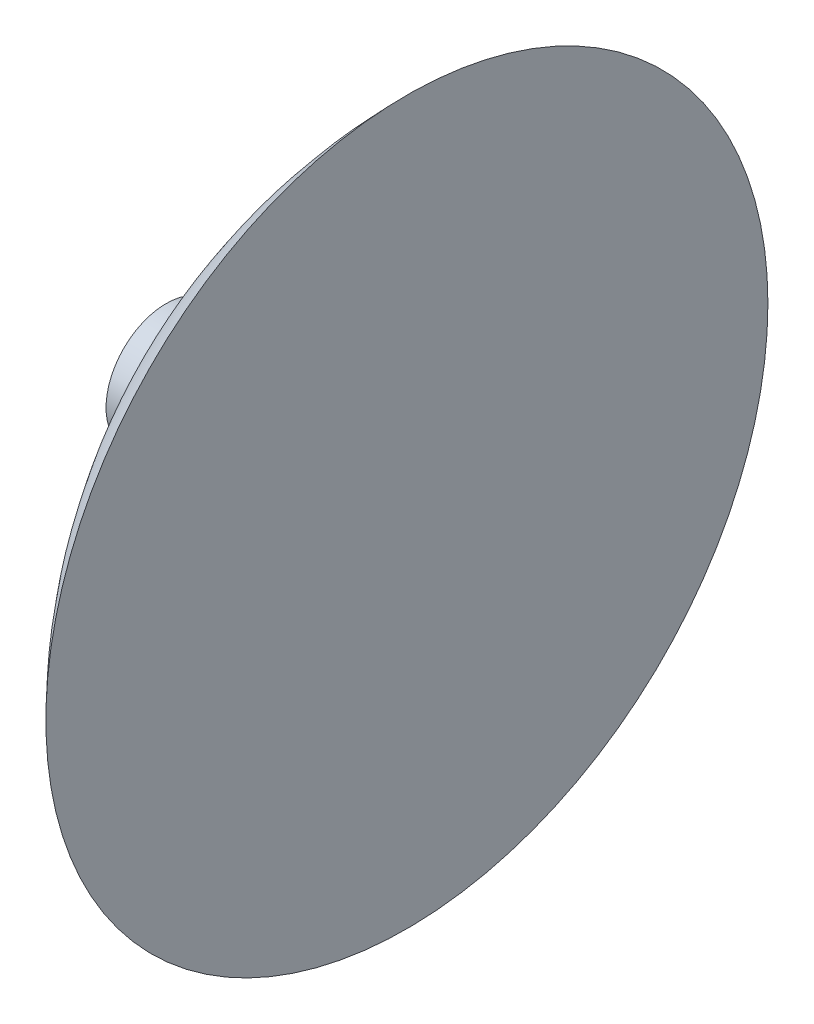
ISO-10303-21;
HEADER;
FILE_DESCRIPTION(('STEP AP214'),'2;1');
FILE_NAME('part.step','',(''),(''),'','','');
FILE_SCHEMA(('AUTOMOTIVE_DESIGN { 1 0 10303 214 1 1 1 1 }'));
ENDSEC;
DATA;
#1=APPLICATION_CONTEXT('core data for automotive mechanical design processes');
#2=APPLICATION_PROTOCOL_DEFINITION('international standard','automotive_design',2000,#1);
#3=PRODUCT_CONTEXT('',#1,'mechanical');
#4=PRODUCT('Part','Part','',(#3));
#5=PRODUCT_RELATED_PRODUCT_CATEGORY('part','',(#4));
#6=PRODUCT_DEFINITION_FORMATION('','',#4);
#7=PRODUCT_DEFINITION_CONTEXT('part definition',#1,'design');
#8=PRODUCT_DEFINITION('design','',#6,#7);
#9=PRODUCT_DEFINITION_SHAPE('','',#8);
#10=(LENGTH_UNIT() NAMED_UNIT(*) SI_UNIT(.MILLI.,.METRE.));
#11=(NAMED_UNIT(*) PLANE_ANGLE_UNIT() SI_UNIT($,.RADIAN.));
#12=(NAMED_UNIT(*) SI_UNIT($,.STERADIAN.) SOLID_ANGLE_UNIT());
#13=UNCERTAINTY_MEASURE_WITH_UNIT(LENGTH_MEASURE(1.E-05),#10,'distance_accuracy_value','');
#14=(GEOMETRIC_REPRESENTATION_CONTEXT(3) GLOBAL_UNCERTAINTY_ASSIGNED_CONTEXT((#13)) GLOBAL_UNIT_ASSIGNED_CONTEXT((#10,
#11,#12)) REPRESENTATION_CONTEXT('',''));
#15=CARTESIAN_POINT('',(0.,0.,0.));
#16=DIRECTION('',(0.,0.,1.));
#17=DIRECTION('',(1.,0.,0.));
#18=AXIS2_PLACEMENT_3D('',#15,#16,#17);
#19=CARTESIAN_POINT('',(0.,0.,0.));
#20=DIRECTION('',(-1.,0.,0.));
#21=DIRECTION('',(0.,0.,-1.));
#22=AXIS2_PLACEMENT_3D('',#19,#20,#21);
#23=SPHERICAL_SURFACE('',#22,1060.66017177981);
#24=CARTESIAN_POINT('',(-1053.26872164703,0.,0.));
#25=DIRECTION('',(1.,0.,0.));
#26=DIRECTION('',(0.,0.,-1.));
#27=AXIS2_PLACEMENT_3D('',#24,#25,#26);
#28=CIRCLE('',#27,125.);
#29=CARTESIAN_POINT('',(-1053.26872164703,0.,-124.999999999999));
#30=VERTEX_POINT('',#29);
#31=EDGE_CURVE('E40',#30,#30,#28,.T.);
#32=CARTESIAN_POINT('',(-749.999999999993,0.,0.));
#33=DIRECTION('',(-1.,0.,0.));
#34=DIRECTION('',(0.,0.,1.));
#35=AXIS2_PLACEMENT_3D('',#32,#33,#34);
#36=CIRCLE('',#35,749.999999999993);
#37=CARTESIAN_POINT('',(-749.999999999992,0.,-749.999999999993));
#38=VERTEX_POINT('',#37);
#39=EDGE_CURVE('E10',#38,#38,#36,.T.);
#40=CARTESIAN_POINT('',(-1053.26872164703,0.,-124.999999999999));
#41=CARTESIAN_POINT('',(-1052.39988912018,0.,-132.321014821956));
#42=CARTESIAN_POINT('',(-1051.45470338212,0.,-139.632967748344));
#43=CARTESIAN_POINT('',(-1049.41208865829,0.,-154.235577866447));
#44=CARTESIAN_POINT('',(-1048.31465967252,0.,-161.526235058163));
#45=CARTESIAN_POINT('',(-1045.96802162798,0.,-176.083081763392));
#46=CARTESIAN_POINT('',(-1044.71881256922,0.,-183.349271276904));
#47=CARTESIAN_POINT('',(-1042.06916128463,0.,-197.854023801824));
#48=CARTESIAN_POINT('',(-1040.6687190588,0.,-205.092586813232));
#49=CARTESIAN_POINT('',(-1037.71720934975,0.,-219.538938857279));
#50=CARTESIAN_POINT('',(-1036.16614186652,0.,-226.74672788992));
#51=CARTESIAN_POINT('',(-1032.91405631785,0.,-241.128398058469));
#52=CARTESIAN_POINT('',(-1031.21303825241,0.,-248.302279194377));
#53=CARTESIAN_POINT('',(-1027.66179107196,0.,-262.613014346962));
#54=CARTESIAN_POINT('',(-1025.81156195696,0.,-269.749868363638));
#55=CARTESIAN_POINT('',(-1021.96269717862,0.,-283.983446167485));
#56=CARTESIAN_POINT('',(-1019.96406151529,0.,-291.080169954655));
#57=CARTESIAN_POINT('',(-1015.81925264439,0.,-305.230401634464));
#58=CARTESIAN_POINT('',(-1013.67307943682,0.,-312.283909527102));
#59=CARTESIAN_POINT('',(-1009.23412863759,0.,-326.344642544062));
#60=CARTESIAN_POINT('',(-1006.94135104594,0.,-333.351867668384));
#61=CARTESIAN_POINT('',(-1002.21018838072,0.,-347.316988398486));
#62=CARTESIAN_POINT('',(-999.771803307158,0.,-354.274884004266));
#63=CARTESIAN_POINT('',(-994.75048589107,0.,-368.138320395662));
#64=CARTESIAN_POINT('',(-992.167553548545,0.,-375.043861181278));
#65=CARTESIAN_POINT('',(-986.858264656697,0.,-388.799585394644));
#66=CARTESIAN_POINT('',(-984.131908107372,0.,-395.649768822394));
#67=CARTESIAN_POINT('',(-978.536956225138,0.,-409.291799851783));
#68=CARTESIAN_POINT('',(-975.668360892228,0.,-416.083647453421));
#69=CARTESIAN_POINT('',(-969.790178711629,0.,-429.606053726826));
#70=CARTESIAN_POINT('',(-966.780591863941,0.,-436.336612398592));
#71=CARTESIAN_POINT('',(-960.621735225877,0.,-449.733514356997));
#72=CARTESIAN_POINT('',(-957.472465435503,0.,-456.399857643635));
#73=CARTESIAN_POINT('',(-951.035612218478,0.,-469.665430297456));
#74=CARTESIAN_POINT('',(-947.748028791828,0.,-476.264659664639));
#75=CARTESIAN_POINT('',(-941.035977747603,0.,-489.393135126437));
#76=CARTESIAN_POINT('',(-937.611510130028,0.,-495.922381221052));
#77=CARTESIAN_POINT('',(-930.627179666719,0.,-508.908051213417));
#78=CARTESIAN_POINT('',(-927.067316820985,0.,-515.364475111167));
#79=CARTESIAN_POINT('',(-919.813743734139,0.,-528.201693448685));
#80=CARTESIAN_POINT('',(-916.120033493027,0.,-534.582487888453));
#81=CARTESIAN_POINT('',(-908.600371645213,0.,-547.26567293267));
#82=CARTESIAN_POINT('',(-904.774420038511,0.,-553.568063537117));
#83=CARTESIAN_POINT('',(-896.991938988039,0.,-566.091700623461));
#84=CARTESIAN_POINT('',(-893.035409544269,0.,-572.312947105356));
#85=CARTESIAN_POINT('',(-884.993493123496,0.,-584.671590940841));
#86=CARTESIAN_POINT('',(-880.908106146494,0.,-590.808988294431));
#87=CARTESIAN_POINT('',(-872.610250990851,0.,-602.997265325584));
#88=CARTESIAN_POINT('',(-868.397782812211,0.,-609.048145003147));
#89=CARTESIAN_POINT('',(-859.847596838669,0.,-621.060755751292));
#90=CARTESIAN_POINT('',(-855.509879043768,0.,-627.022486821873));
#91=CARTESIAN_POINT('',(-846.711079886552,0.,-638.854208191608));
#92=CARTESIAN_POINT('',(-842.249998524238,0.,-644.724198490763));
#93=CARTESIAN_POINT('',(-833.206411901825,0.,-656.369886025081));
#94=CARTESIAN_POINT('',(-828.623906641726,0.,-662.145583260244));
#95=CARTESIAN_POINT('',(-819.339464755261,0.,-673.60017343666));
#96=CARTESIAN_POINT('',(-814.637528128895,0.,-679.279066377912));
#97=CARTESIAN_POINT('',(-805.11626772166,0.,-690.537578588716));
#98=CARTESIAN_POINT('',(-800.296943940792,0.,-696.117197858267));
#99=CARTESIAN_POINT('',(-790.543005404401,0.,-707.174737402281));
#100=CARTESIAN_POINT('',(-785.608390648878,0.,-712.652657676742));
#101=CARTESIAN_POINT('',(-775.626013008336,0.,-723.504414804194));
#102=CARTESIAN_POINT('',(-770.578250123317,0.,-728.878251657183));
#103=CARTESIAN_POINT('',(-760.371781191279,0.,-739.519515168191));
#104=CARTESIAN_POINT('',(-755.213075144261,0.,-744.78694182621));
#105=CARTESIAN_POINT('',(-749.999999999992,0.,-749.999999999993));
#106=B_SPLINE_CURVE_WITH_KNOTS('',3,(#40,#41,#42,#43,#44,#45,#46,#47,#48,#49,#50,#51,#52,#53,
#54,#55,#56,#57,#58,#59,#60,#61,#62,#63,#64,#65,#66,#67,#68,#69,#70,#71,#72,#73,#74,#75,#76,#77,
#78,#79,#80,#81,#82,#83,#84,#85,#86,#87,#88,#89,#90,#91,#92,#93,#94,#95,#96,#97,#98,#99,#100,
#101,#102,#103,#104,#105),.UNSPECIFIED.,.F.,.F.,(4,2,2,2,2,2,2,2,2,2,2,2,2,2,2,2,2,2,2,2,2,2,2,
2,2,2,2,2,2,2,2,2,4),(0.,22.1167672818491,44.2335345636981,66.3503018455472,88.4670691273963,
110.583836409245,132.700603691094,154.817370972944,176.934138254793,199.050905536642,
221.167672818491,243.28444010034,265.401207382189,287.517974664038,309.634741945887,
331.751509227736,353.868276509585,375.985043791434,398.101811073283,420.218578355133,
442.335345636982,464.452112918831,486.56888020068,508.685647482529,530.802414764378,
552.919182046227,575.035949328076,597.152716609925,619.269483891774,641.386251173623,
663.503018455473,685.619785737322,707.736553019171),.UNSPECIFIED.);
#107=EDGE_CURVE('BSEAM34',#30,#38,#106,.T.);
#108=ORIENTED_EDGE('',*,*,#31,.T.);
#109=ORIENTED_EDGE('',*,*,#39,.T.);
#110=ORIENTED_EDGE('',*,*,#107,.T.);
#111=ORIENTED_EDGE('',*,*,#107,.F.);
#112=EDGE_LOOP('',(#108,#110,#109,#111));
#113=FACE_BOUND('',#112,.T.);
#114=ADVANCED_FACE('F34',(#113),#23,.T.);
#115=CARTESIAN_POINT('',(-749.999999999993,0.,-749.999999999993));
#116=DIRECTION('',(-1.,0.,0.));
#117=DIRECTION('',(0.,0.,1.));
#118=AXIS2_PLACEMENT_3D('',#115,#116,#117);
#119=PLANE('',#118);
#120=ORIENTED_EDGE('',*,*,#39,.F.);
#121=EDGE_LOOP('',(#120));
#122=FACE_BOUND('',#121,.T.);
#123=ADVANCED_FACE('F60',(#122),#119,.F.);
#124=CARTESIAN_POINT('',(-1249.99999999999,0.,0.));
#125=DIRECTION('',(1.,0.,0.));
#126=DIRECTION('',(0.,0.,-1.));
#127=AXIS2_PLACEMENT_3D('',#124,#125,#126);
#128=CYLINDRICAL_SURFACE('',#127,125.);
#129=CARTESIAN_POINT('',(-1249.99999999999,0.,0.));
#130=DIRECTION('',(1.,0.,0.));
#131=DIRECTION('',(0.,0.,-1.));
#132=AXIS2_PLACEMENT_3D('',#129,#130,#131);
#133=CIRCLE('',#132,125.);
#134=CARTESIAN_POINT('',(-1249.99999999999,0.,-125.));
#135=VERTEX_POINT('',#134);
#136=EDGE_CURVE('E44',#135,#135,#133,.T.);
#137=ORIENTED_EDGE('',*,*,#136,.T.);
#138=EDGE_LOOP('',(#137));
#139=FACE_BOUND('',#138,.T.);
#140=ORIENTED_EDGE('',*,*,#31,.F.);
#141=EDGE_LOOP('',(#140));
#142=FACE_BOUND('',#141,.T.);
#143=ADVANCED_FACE('F51',(#139,#142),#128,.T.);
#144=CARTESIAN_POINT('',(-1249.99999999999,0.,0.));
#145=DIRECTION('',(1.,0.,0.));
#146=DIRECTION('',(0.,0.,-1.));
#147=AXIS2_PLACEMENT_3D('',#144,#145,#146);
#148=PLANE('',#147);
#149=ORIENTED_EDGE('',*,*,#136,.F.);
#150=EDGE_LOOP('',(#149));
#151=FACE_BOUND('',#150,.T.);
#152=ADVANCED_FACE('F54',(#151),#148,.F.);
#153=CLOSED_SHELL('',(#114,#123,#143,#152));
#154=MANIFOLD_SOLID_BREP('B2',#153);
#155=ADVANCED_BREP_SHAPE_REPRESENTATION('',(#18,#154),#14);
#156=SHAPE_DEFINITION_REPRESENTATION(#9,#155);
ENDSEC;
END-ISO-10303-21;
